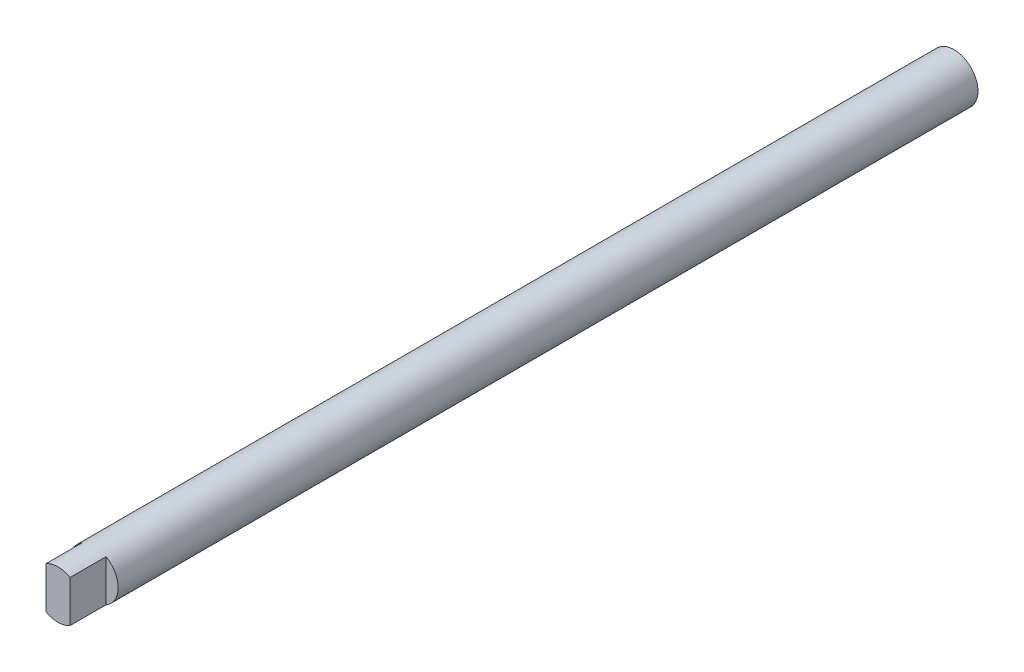
ISO-10303-21;
HEADER;
FILE_DESCRIPTION(('STEP AP214'),'2;1');
FILE_NAME('part.step','',(''),(''),'','','');
FILE_SCHEMA(('AUTOMOTIVE_DESIGN { 1 0 10303 214 1 1 1 1 }'));
ENDSEC;
DATA;
#1=APPLICATION_CONTEXT('core data for automotive mechanical design processes');
#2=APPLICATION_PROTOCOL_DEFINITION('international standard','automotive_design',2000,#1);
#3=PRODUCT_CONTEXT('',#1,'mechanical');
#4=PRODUCT('Part','Part','',(#3));
#5=PRODUCT_RELATED_PRODUCT_CATEGORY('part','',(#4));
#6=PRODUCT_DEFINITION_FORMATION('','',#4);
#7=PRODUCT_DEFINITION_CONTEXT('part definition',#1,'design');
#8=PRODUCT_DEFINITION('design','',#6,#7);
#9=PRODUCT_DEFINITION_SHAPE('','',#8);
#10=(LENGTH_UNIT() NAMED_UNIT(*) SI_UNIT(.MILLI.,.METRE.));
#11=(NAMED_UNIT(*) PLANE_ANGLE_UNIT() SI_UNIT($,.RADIAN.));
#12=(NAMED_UNIT(*) SI_UNIT($,.STERADIAN.) SOLID_ANGLE_UNIT());
#13=UNCERTAINTY_MEASURE_WITH_UNIT(LENGTH_MEASURE(1.E-05),#10,'distance_accuracy_value','');
#14=(GEOMETRIC_REPRESENTATION_CONTEXT(3) GLOBAL_UNCERTAINTY_ASSIGNED_CONTEXT((#13)) GLOBAL_UNIT_ASSIGNED_CONTEXT((#10,
#11,#12)) REPRESENTATION_CONTEXT('',''));
#15=CARTESIAN_POINT('',(0.,0.,0.));
#16=DIRECTION('',(0.,0.,1.));
#17=DIRECTION('',(1.,0.,0.));
#18=AXIS2_PLACEMENT_3D('',#15,#16,#17);
#19=CARTESIAN_POINT('',(0.,0.,74.5));
#20=DIRECTION('',(0.,0.,-1.));
#21=DIRECTION('',(-1.,0.,0.));
#22=AXIS2_PLACEMENT_3D('',#19,#20,#21);
#23=CYLINDRICAL_SURFACE('',#22,4.);
#24=CARTESIAN_POINT('',(0.,0.,74.5));
#25=DIRECTION('',(0.,0.,1.));
#26=DIRECTION('',(1.,0.,0.));
#27=AXIS2_PLACEMENT_3D('',#24,#25,#26);
#28=CIRCLE('',#27,4.);
#29=CARTESIAN_POINT('',(2.,3.46410161513775,74.5));
#30=VERTEX_POINT('',#29);
#31=CARTESIAN_POINT('',(-2.,3.46410161513775,74.5));
#32=VERTEX_POINT('',#31);
#33=EDGE_CURVE('E106',#30,#32,#28,.T.);
#34=ORIENTED_EDGE('',*,*,#33,.F.);
#35=DIRECTION('',(0.,0.,-1.));
#36=VECTOR('',#35,1.);
#37=CARTESIAN_POINT('',(2.,3.46410161513775,74.5));
#38=LINE('',#37,#36);
#39=CARTESIAN_POINT('',(2.,3.46410161513775,68.4999999999999));
#40=VERTEX_POINT('',#39);
#41=EDGE_CURVE('E64',#30,#40,#38,.T.);
#42=ORIENTED_EDGE('',*,*,#41,.T.);
#43=CARTESIAN_POINT('',(0.,0.,68.4999999999999));
#44=DIRECTION('',(0.,0.,-1.));
#45=DIRECTION('',(-1.,0.,0.));
#46=AXIS2_PLACEMENT_3D('',#43,#44,#45);
#47=CIRCLE('',#46,4.);
#48=CARTESIAN_POINT('',(2.,-3.46410161513775,68.4999999999999));
#49=VERTEX_POINT('',#48);
#50=EDGE_CURVE('E13',#40,#49,#47,.T.);
#51=ORIENTED_EDGE('',*,*,#50,.T.);
#52=DIRECTION('',(0.,0.,-1.));
#53=VECTOR('',#52,1.);
#54=CARTESIAN_POINT('',(2.,-3.46410161513775,74.5));
#55=LINE('',#54,#53);
#56=CARTESIAN_POINT('',(2.,-3.46410161513775,74.5));
#57=VERTEX_POINT('',#56);
#58=EDGE_CURVE('E92',#49,#57,#55,.F.);
#59=ORIENTED_EDGE('',*,*,#58,.T.);
#60=CARTESIAN_POINT('',(-1.99999999999999,-3.46410161513775,74.5));
#61=VERTEX_POINT('',#60);
#62=EDGE_CURVE('E101',#61,#57,#28,.T.);
#63=ORIENTED_EDGE('',*,*,#62,.F.);
#64=DIRECTION('',(0.,0.,-1.));
#65=VECTOR('',#64,1.);
#66=CARTESIAN_POINT('',(-1.99999999999999,-3.46410161513775,74.5));
#67=LINE('',#66,#65);
#68=CARTESIAN_POINT('',(-2.,-3.46410161513775,68.5));
#69=VERTEX_POINT('',#68);
#70=EDGE_CURVE('E72',#61,#69,#67,.T.);
#71=ORIENTED_EDGE('',*,*,#70,.T.);
#72=CARTESIAN_POINT('',(0.,0.,68.4999999999999));
#73=DIRECTION('',(0.,0.,-1.));
#74=DIRECTION('',(-1.,0.,0.));
#75=AXIS2_PLACEMENT_3D('',#72,#73,#74);
#76=CIRCLE('',#75,4.);
#77=CARTESIAN_POINT('',(-1.99999999999999,3.46410161513775,68.4999999999999));
#78=VERTEX_POINT('',#77);
#79=EDGE_CURVE('E97',#69,#78,#76,.T.);
#80=ORIENTED_EDGE('',*,*,#79,.T.);
#81=DIRECTION('',(0.,0.,-1.));
#82=VECTOR('',#81,1.);
#83=CARTESIAN_POINT('',(-2.,3.46410161513775,74.5));
#84=LINE('',#83,#82);
#85=EDGE_CURVE('E118',#78,#32,#84,.F.);
#86=ORIENTED_EDGE('',*,*,#85,.T.);
#87=EDGE_LOOP('',(#34,#42,#51,#59,#63,#71,#80,#86));
#88=FACE_BOUND('',#87,.T.);
#89=CARTESIAN_POINT('',(0.,0.,-74.5));
#90=DIRECTION('',(0.,0.,1.));
#91=DIRECTION('',(1.,0.,0.));
#92=AXIS2_PLACEMENT_3D('',#89,#90,#91);
#93=CIRCLE('',#92,4.);
#94=CARTESIAN_POINT('',(4.00000000000001,0.,-74.5));
#95=VERTEX_POINT('',#94);
#96=EDGE_CURVE('E109',#95,#95,#93,.T.);
#97=ORIENTED_EDGE('',*,*,#96,.T.);
#98=EDGE_LOOP('',(#97));
#99=FACE_BOUND('',#98,.T.);
#100=ADVANCED_FACE('F50',(#88,#99),#23,.T.);
#101=CARTESIAN_POINT('',(0.,0.,74.5));
#102=DIRECTION('',(0.,0.,1.));
#103=DIRECTION('',(1.,0.,0.));
#104=AXIS2_PLACEMENT_3D('',#101,#102,#103);
#105=PLANE('',#104);
#106=DIRECTION('',(0.,-1.,0.));
#107=VECTOR('',#106,1.);
#108=CARTESIAN_POINT('',(2.00000000000001,0.,74.5));
#109=LINE('',#108,#107);
#110=EDGE_CURVE('E57',#30,#57,#109,.T.);
#111=ORIENTED_EDGE('',*,*,#110,.F.);
#112=ORIENTED_EDGE('',*,*,#33,.T.);
#113=DIRECTION('',(0.,1.,0.));
#114=VECTOR('',#113,1.);
#115=CARTESIAN_POINT('',(-2.,0.,74.5));
#116=LINE('',#115,#114);
#117=EDGE_CURVE('E105',#61,#32,#116,.T.);
#118=ORIENTED_EDGE('',*,*,#117,.F.);
#119=ORIENTED_EDGE('',*,*,#62,.T.);
#120=EDGE_LOOP('',(#111,#112,#118,#119));
#121=FACE_BOUND('',#120,.T.);
#122=ADVANCED_FACE('F104',(#121),#105,.T.);
#123=CARTESIAN_POINT('',(0.,0.,-74.5));
#124=DIRECTION('',(0.,0.,1.));
#125=DIRECTION('',(1.,0.,0.));
#126=AXIS2_PLACEMENT_3D('',#123,#124,#125);
#127=PLANE('',#126);
#128=ORIENTED_EDGE('',*,*,#96,.F.);
#129=EDGE_LOOP('',(#128));
#130=FACE_BOUND('',#129,.T.);
#131=ADVANCED_FACE('F141',(#130),#127,.F.);
#132=CARTESIAN_POINT('',(-2.,-4.,68.4999999999999));
#133=DIRECTION('',(0.,0.,-1.));
#134=DIRECTION('',(-1.,0.,0.));
#135=AXIS2_PLACEMENT_3D('',#132,#133,#134);
#136=PLANE('',#135);
#137=ORIENTED_EDGE('',*,*,#79,.F.);
#138=DIRECTION('',(0.,1.,0.));
#139=VECTOR('',#138,1.);
#140=CARTESIAN_POINT('',(-2.,-4.,68.4999999999999));
#141=LINE('',#140,#139);
#142=EDGE_CURVE('E122',#69,#78,#141,.T.);
#143=ORIENTED_EDGE('',*,*,#142,.T.);
#144=EDGE_LOOP('',(#137,#143));
#145=FACE_BOUND('',#144,.T.);
#146=ADVANCED_FACE('F121',(#145),#136,.F.);
#147=CARTESIAN_POINT('',(-1.99999999999999,-4.,74.5));
#148=DIRECTION('',(1.,0.,0.));
#149=DIRECTION('',(0.,0.,-1.));
#150=AXIS2_PLACEMENT_3D('',#147,#148,#149);
#151=PLANE('',#150);
#152=ORIENTED_EDGE('',*,*,#117,.T.);
#153=ORIENTED_EDGE('',*,*,#85,.F.);
#154=ORIENTED_EDGE('',*,*,#142,.F.);
#155=ORIENTED_EDGE('',*,*,#70,.F.);
#156=EDGE_LOOP('',(#152,#153,#154,#155));
#157=FACE_BOUND('',#156,.T.);
#158=ADVANCED_FACE('F123',(#157),#151,.F.);
#159=CARTESIAN_POINT('',(2.,-4.,68.4999999999999));
#160=DIRECTION('',(0.,0.,-1.));
#161=DIRECTION('',(-1.,0.,0.));
#162=AXIS2_PLACEMENT_3D('',#159,#160,#161);
#163=PLANE('',#162);
#164=DIRECTION('',(0.,1.,0.));
#165=VECTOR('',#164,1.);
#166=CARTESIAN_POINT('',(2.,-4.,68.4999999999999));
#167=LINE('',#166,#165);
#168=EDGE_CURVE('E102',#49,#40,#167,.T.);
#169=ORIENTED_EDGE('',*,*,#168,.F.);
#170=ORIENTED_EDGE('',*,*,#50,.F.);
#171=EDGE_LOOP('',(#169,#170));
#172=FACE_BOUND('',#171,.T.);
#173=ADVANCED_FACE('F128',(#172),#163,.F.);
#174=CARTESIAN_POINT('',(2.00000000000001,-4.,74.4999999999999));
#175=DIRECTION('',(-1.,0.,0.));
#176=DIRECTION('',(0.,0.,1.));
#177=AXIS2_PLACEMENT_3D('',#174,#175,#176);
#178=PLANE('',#177);
#179=ORIENTED_EDGE('',*,*,#110,.T.);
#180=ORIENTED_EDGE('',*,*,#58,.F.);
#181=ORIENTED_EDGE('',*,*,#168,.T.);
#182=ORIENTED_EDGE('',*,*,#41,.F.);
#183=EDGE_LOOP('',(#179,#180,#181,#182));
#184=FACE_BOUND('',#183,.T.);
#185=ADVANCED_FACE('F91',(#184),#178,.F.);
#186=CLOSED_SHELL('',(#100,#122,#131,#146,#158,#173,#185));
#187=MANIFOLD_SOLID_BREP('B2',#186);
#188=ADVANCED_BREP_SHAPE_REPRESENTATION('',(#18,#187),#14);
#189=SHAPE_DEFINITION_REPRESENTATION(#9,#188);
ENDSEC;
END-ISO-10303-21;
